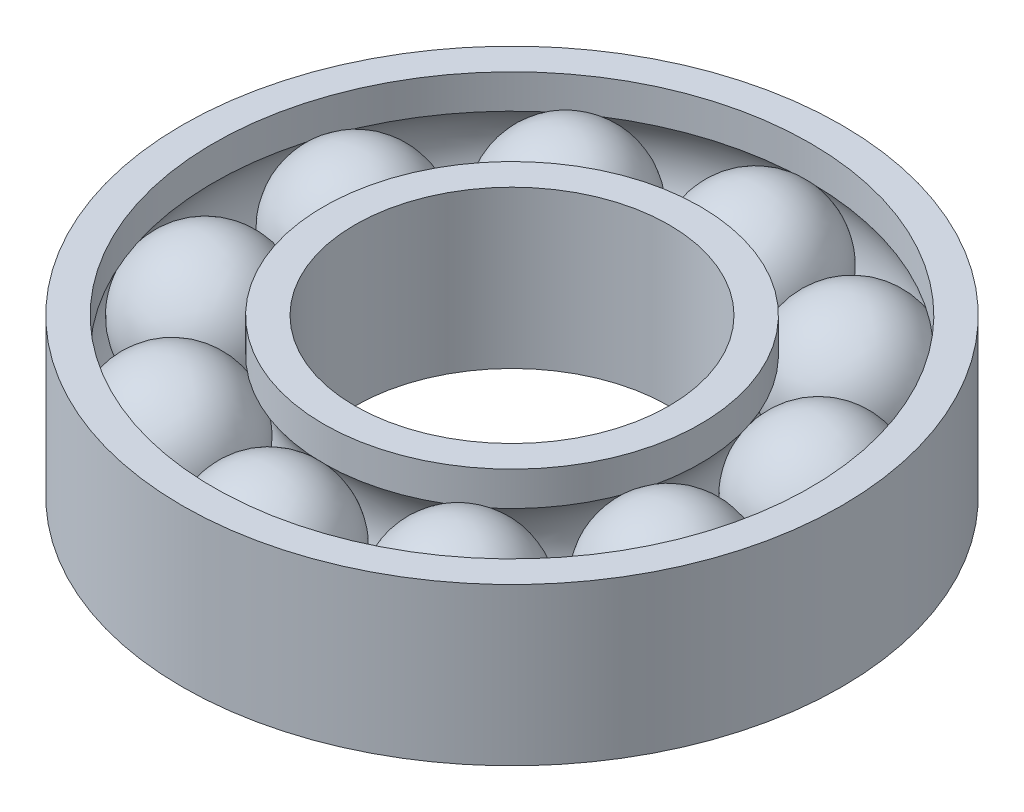
ISO-10303-21;
HEADER;
FILE_DESCRIPTION(('STEP AP214'),'2;1');
FILE_NAME('part.step','',(''),(''),'','','');
FILE_SCHEMA(('AUTOMOTIVE_DESIGN { 1 0 10303 214 1 1 1 1 }'));
ENDSEC;
DATA;
#1=APPLICATION_CONTEXT('core data for automotive mechanical design processes');
#2=APPLICATION_PROTOCOL_DEFINITION('international standard','automotive_design',2000,#1);
#3=PRODUCT_CONTEXT('',#1,'mechanical');
#4=PRODUCT('Part','Part','',(#3));
#5=PRODUCT_RELATED_PRODUCT_CATEGORY('part','',(#4));
#6=PRODUCT_DEFINITION_FORMATION('','',#4);
#7=PRODUCT_DEFINITION_CONTEXT('part definition',#1,'design');
#8=PRODUCT_DEFINITION('design','',#6,#7);
#9=PRODUCT_DEFINITION_SHAPE('','',#8);
#10=(LENGTH_UNIT() NAMED_UNIT(*) SI_UNIT(.MILLI.,.METRE.));
#11=(NAMED_UNIT(*) PLANE_ANGLE_UNIT() SI_UNIT($,.RADIAN.));
#12=(NAMED_UNIT(*) SI_UNIT($,.STERADIAN.) SOLID_ANGLE_UNIT());
#13=UNCERTAINTY_MEASURE_WITH_UNIT(LENGTH_MEASURE(1.E-05),#10,'distance_accuracy_value','');
#14=(GEOMETRIC_REPRESENTATION_CONTEXT(3) GLOBAL_UNCERTAINTY_ASSIGNED_CONTEXT((#13)) GLOBAL_UNIT_ASSIGNED_CONTEXT((#10,
#11,#12)) REPRESENTATION_CONTEXT('',''));
#15=CARTESIAN_POINT('',(0.,0.,0.));
#16=DIRECTION('',(0.,0.,1.));
#17=DIRECTION('',(1.,0.,0.));
#18=AXIS2_PLACEMENT_3D('',#15,#16,#17);
#19=CARTESIAN_POINT('',(45.5533570526658,0.,-62.698817064059));
#20=DIRECTION('',(-0.587785252292462,0.,0.809016994374955));
#21=DIRECTION('',(0.,-1.,0.));
#22=AXIS2_PLACEMENT_3D('',#19,#20,#21);
#23=SPHERICAL_SURFACE('',#22,22.5);
#24=CARTESIAN_POINT('',(32.3281888760854,0.,-44.4959346906225));
#25=VERTEX_POINT('',#24);
#26=VERTEX_LOOP('',#25);
#27=FACE_BOUND('',#26,.T.);
#28=ADVANCED_FACE('F41',(#27),#23,.T.);
#29=CLOSED_SHELL('',(#28));
#30=MANIFOLD_SOLID_BREP('B2',#29);
#31=CARTESIAN_POINT('',(73.7068800128742,0.,-23.9488170640593));
#32=DIRECTION('',(-0.95105651629515,0.,0.309016994374958));
#33=DIRECTION('',(0.,-1.,0.));
#34=AXIS2_PLACEMENT_3D('',#31,#32,#33);
#35=SPHERICAL_SURFACE('',#34,22.5);
#36=CARTESIAN_POINT('',(52.3081083962333,0.,-16.9959346906227));
#37=VERTEX_POINT('',#36);
#38=VERTEX_LOOP('',#37);
#39=FACE_BOUND('',#38,.T.);
#40=ADVANCED_FACE('F59',(#39),#35,.T.);
#41=CLOSED_SHELL('',(#40));
#42=MANIFOLD_SOLID_BREP('B6',#41);
#43=CARTESIAN_POINT('',(73.7068800128746,0.,23.9488170640577));
#44=DIRECTION('',(-0.951056516295157,0.,-0.309016994374938));
#45=DIRECTION('',(0.,-1.,0.));
#46=AXIS2_PLACEMENT_3D('',#43,#44,#45);
#47=SPHERICAL_SURFACE('',#46,22.5);
#48=CARTESIAN_POINT('',(52.3081083962336,0.,16.9959346906216));
#49=VERTEX_POINT('',#48);
#50=VERTEX_LOOP('',#49);
#51=FACE_BOUND('',#50,.T.);
#52=ADVANCED_FACE('F77',(#51),#47,.T.);
#53=CLOSED_SHELL('',(#52));
#54=MANIFOLD_SOLID_BREP('B37',#53);
#55=CARTESIAN_POINT('',(45.5533570526672,0.,62.698817064058));
#56=DIRECTION('',(-0.58778525229248,0.,-0.809016994374942));
#57=DIRECTION('',(0.,-1.,0.));
#58=AXIS2_PLACEMENT_3D('',#55,#56,#57);
#59=SPHERICAL_SURFACE('',#58,22.5);
#60=CARTESIAN_POINT('',(32.3281888760864,0.,44.4959346906218));
#61=VERTEX_POINT('',#60);
#62=VERTEX_LOOP('',#61);
#63=FACE_BOUND('',#62,.T.);
#64=ADVANCED_FACE('F95',(#63),#59,.T.);
#65=CLOSED_SHELL('',(#64));
#66=MANIFOLD_SOLID_BREP('B55',#65);
#67=CARTESIAN_POINT('',(0.,0.,77.5));
#68=DIRECTION('',(0.,0.,-1.));
#69=DIRECTION('',(0.,-1.,0.));
#70=AXIS2_PLACEMENT_3D('',#67,#68,#69);
#71=SPHERICAL_SURFACE('',#70,22.5);
#72=CARTESIAN_POINT('',(0.,0.,55.));
#73=VERTEX_POINT('',#72);
#74=VERTEX_LOOP('',#73);
#75=FACE_BOUND('',#74,.T.);
#76=ADVANCED_FACE('F113',(#75),#71,.T.);
#77=CLOSED_SHELL('',(#76));
#78=MANIFOLD_SOLID_BREP('B73',#77);
#79=CARTESIAN_POINT('',(-45.5533570526663,0.,62.6988170640587));
#80=DIRECTION('',(0.587785252292469,0.,-0.809016994374951));
#81=DIRECTION('',(0.,-1.,0.));
#82=AXIS2_PLACEMENT_3D('',#79,#80,#81);
#83=SPHERICAL_SURFACE('',#82,22.5);
#84=CARTESIAN_POINT('',(-32.3281888760858,0.,44.4959346906223));
#85=VERTEX_POINT('',#84);
#86=VERTEX_LOOP('',#85);
#87=FACE_BOUND('',#86,.T.);
#88=ADVANCED_FACE('F131',(#87),#83,.T.);
#89=CLOSED_SHELL('',(#88));
#90=MANIFOLD_SOLID_BREP('B91',#89);
#91=CARTESIAN_POINT('',(-73.7068800128743,0.,23.9488170640588));
#92=DIRECTION('',(0.951056516295152,0.,-0.309016994374952));
#93=DIRECTION('',(0.,-1.,0.));
#94=AXIS2_PLACEMENT_3D('',#91,#92,#93);
#95=SPHERICAL_SURFACE('',#94,22.5);
#96=CARTESIAN_POINT('',(-52.3081083962334,0.,16.9959346906223));
#97=VERTEX_POINT('',#96);
#98=VERTEX_LOOP('',#97);
#99=FACE_BOUND('',#98,.T.);
#100=ADVANCED_FACE('F149',(#99),#95,.T.);
#101=CLOSED_SHELL('',(#100));
#102=MANIFOLD_SOLID_BREP('B109',#101);
#103=CARTESIAN_POINT('',(-73.7068800128745,0.,-23.9488170640582));
#104=DIRECTION('',(0.951056516295155,0.,0.309016994374945));
#105=DIRECTION('',(0.,-1.,0.));
#106=AXIS2_PLACEMENT_3D('',#103,#104,#105);
#107=SPHERICAL_SURFACE('',#106,22.5);
#108=CARTESIAN_POINT('',(-52.3081083962335,0.,-16.995934690622));
#109=VERTEX_POINT('',#108);
#110=VERTEX_LOOP('',#109);
#111=FACE_BOUND('',#110,.T.);
#112=ADVANCED_FACE('F167',(#111),#107,.T.);
#113=CLOSED_SHELL('',(#112));
#114=MANIFOLD_SOLID_BREP('B127',#113);
#115=CARTESIAN_POINT('',(-45.5533570526668,0.,-62.6988170640584));
#116=DIRECTION('',(0.587785252292474,0.,0.809016994374947));
#117=DIRECTION('',(0.,-1.,0.));
#118=AXIS2_PLACEMENT_3D('',#115,#116,#117);
#119=SPHERICAL_SURFACE('',#118,22.5);
#120=CARTESIAN_POINT('',(-32.3281888760861,0.,-44.4959346906221));
#121=VERTEX_POINT('',#120);
#122=VERTEX_LOOP('',#121);
#123=FACE_BOUND('',#122,.T.);
#124=ADVANCED_FACE('F187',(#123),#119,.T.);
#125=CLOSED_SHELL('',(#124));
#126=MANIFOLD_SOLID_BREP('B145',#125);
#127=CARTESIAN_POINT('',(0.,0.,0.));
#128=DIRECTION('',(0.,-1.,0.));
#129=DIRECTION('',(0.,0.,-1.));
#130=AXIS2_PLACEMENT_3D('',#127,#128,#129);
#131=TOROIDAL_SURFACE('',#130,77.5,22.5);
#132=CARTESIAN_POINT('',(0.,14.1421356237309,0.));
#133=DIRECTION('',(0.,-1.,0.));
#134=DIRECTION('',(0.,0.,-1.));
#135=AXIS2_PLACEMENT_3D('',#132,#133,#134);
#136=CIRCLE('',#135,95.);
#137=CARTESIAN_POINT('',(0.,14.1421356237309,-95.));
#138=VERTEX_POINT('',#137);
#139=EDGE_CURVE('E229',#138,#138,#136,.T.);
#140=ORIENTED_EDGE('',*,*,#139,.F.);
#141=EDGE_LOOP('',(#140));
#142=FACE_BOUND('',#141,.T.);
#143=CARTESIAN_POINT('',(0.,-14.1421356237309,0.));
#144=DIRECTION('',(0.,-1.,0.));
#145=DIRECTION('',(0.,0.,-1.));
#146=AXIS2_PLACEMENT_3D('',#143,#144,#145);
#147=CIRCLE('',#146,95.);
#148=CARTESIAN_POINT('',(0.,-14.1421356237309,-95.));
#149=VERTEX_POINT('',#148);
#150=EDGE_CURVE('E186',#149,#149,#147,.T.);
#151=ORIENTED_EDGE('',*,*,#150,.T.);
#152=EDGE_LOOP('',(#151));
#153=FACE_BOUND('',#152,.T.);
#154=ADVANCED_FACE('F207',(#142,#153),#131,.F.);
#155=CARTESIAN_POINT('',(0.,-25.,0.));
#156=DIRECTION('',(0.,-1.,0.));
#157=DIRECTION('',(0.,0.,-1.));
#158=AXIS2_PLACEMENT_3D('',#155,#156,#157);
#159=CYLINDRICAL_SURFACE('',#158,95.);
#160=ORIENTED_EDGE('',*,*,#150,.F.);
#161=EDGE_LOOP('',(#160));
#162=FACE_BOUND('',#161,.T.);
#163=CARTESIAN_POINT('',(0.,-25.,0.));
#164=DIRECTION('',(0.,-1.,0.));
#165=DIRECTION('',(0.,0.,-1.));
#166=AXIS2_PLACEMENT_3D('',#163,#164,#165);
#167=CIRCLE('',#166,95.);
#168=CARTESIAN_POINT('',(0.,-25.,-95.));
#169=VERTEX_POINT('',#168);
#170=EDGE_CURVE('E213',#169,#169,#167,.T.);
#171=ORIENTED_EDGE('',*,*,#170,.T.);
#172=EDGE_LOOP('',(#171));
#173=FACE_BOUND('',#172,.T.);
#174=ADVANCED_FACE('F236',(#162,#173),#159,.F.);
#175=CARTESIAN_POINT('',(0.,-25.,0.));
#176=DIRECTION('',(0.,-1.,0.));
#177=DIRECTION('',(0.,0.,-1.));
#178=AXIS2_PLACEMENT_3D('',#175,#176,#177);
#179=PLANE('',#178);
#180=CARTESIAN_POINT('',(0.,-25.,0.));
#181=DIRECTION('',(0.,-1.,0.));
#182=DIRECTION('',(0.,0.,-1.));
#183=AXIS2_PLACEMENT_3D('',#180,#181,#182);
#184=CIRCLE('',#183,105.);
#185=CARTESIAN_POINT('',(0.,-25.,-105.));
#186=VERTEX_POINT('',#185);
#187=EDGE_CURVE('E217',#186,#186,#184,.T.);
#188=ORIENTED_EDGE('',*,*,#187,.T.);
#189=EDGE_LOOP('',(#188));
#190=FACE_BOUND('',#189,.T.);
#191=ORIENTED_EDGE('',*,*,#170,.F.);
#192=EDGE_LOOP('',(#191));
#193=FACE_BOUND('',#192,.T.);
#194=ADVANCED_FACE('F240',(#190,#193),#179,.T.);
#195=CARTESIAN_POINT('',(0.,-25.,0.));
#196=DIRECTION('',(0.,-1.,0.));
#197=DIRECTION('',(0.,0.,-1.));
#198=AXIS2_PLACEMENT_3D('',#195,#196,#197);
#199=CYLINDRICAL_SURFACE('',#198,105.);
#200=CARTESIAN_POINT('',(0.,25.,0.));
#201=DIRECTION('',(0.,-1.,0.));
#202=DIRECTION('',(0.,0.,-1.));
#203=AXIS2_PLACEMENT_3D('',#200,#201,#202);
#204=CIRCLE('',#203,105.);
#205=CARTESIAN_POINT('',(0.,25.,-105.));
#206=VERTEX_POINT('',#205);
#207=EDGE_CURVE('E221',#206,#206,#204,.T.);
#208=ORIENTED_EDGE('',*,*,#207,.T.);
#209=EDGE_LOOP('',(#208));
#210=FACE_BOUND('',#209,.T.);
#211=ORIENTED_EDGE('',*,*,#187,.F.);
#212=EDGE_LOOP('',(#211));
#213=FACE_BOUND('',#212,.T.);
#214=ADVANCED_FACE('F245',(#210,#213),#199,.T.);
#215=CARTESIAN_POINT('',(0.,25.,0.));
#216=DIRECTION('',(0.,-1.,0.));
#217=DIRECTION('',(0.,0.,-1.));
#218=AXIS2_PLACEMENT_3D('',#215,#216,#217);
#219=PLANE('',#218);
#220=ORIENTED_EDGE('',*,*,#207,.F.);
#221=EDGE_LOOP('',(#220));
#222=FACE_BOUND('',#221,.T.);
#223=CARTESIAN_POINT('',(0.,25.,0.));
#224=DIRECTION('',(0.,-1.,0.));
#225=DIRECTION('',(0.,0.,-1.));
#226=AXIS2_PLACEMENT_3D('',#223,#224,#225);
#227=CIRCLE('',#226,95.);
#228=CARTESIAN_POINT('',(0.,25.,-95.));
#229=VERTEX_POINT('',#228);
#230=EDGE_CURVE('E226',#229,#229,#227,.T.);
#231=ORIENTED_EDGE('',*,*,#230,.T.);
#232=EDGE_LOOP('',(#231));
#233=FACE_BOUND('',#232,.T.);
#234=ADVANCED_FACE('F251',(#222,#233),#219,.F.);
#235=CARTESIAN_POINT('',(0.,-25.,0.));
#236=DIRECTION('',(0.,-1.,0.));
#237=DIRECTION('',(0.,0.,-1.));
#238=AXIS2_PLACEMENT_3D('',#235,#236,#237);
#239=CYLINDRICAL_SURFACE('',#238,95.);
#240=ORIENTED_EDGE('',*,*,#230,.F.);
#241=EDGE_LOOP('',(#240));
#242=FACE_BOUND('',#241,.T.);
#243=ORIENTED_EDGE('',*,*,#139,.T.);
#244=EDGE_LOOP('',(#243));
#245=FACE_BOUND('',#244,.T.);
#246=ADVANCED_FACE('F233',(#242,#245),#239,.F.);
#247=CLOSED_SHELL('',(#154,#174,#194,#214,#234,#246));
#248=MANIFOLD_SOLID_BREP('B163',#247);
#249=CARTESIAN_POINT('',(0.,0.,0.));
#250=DIRECTION('',(0.,-1.,0.));
#251=DIRECTION('',(0.,0.,-1.));
#252=AXIS2_PLACEMENT_3D('',#249,#250,#251);
#253=TOROIDAL_SURFACE('',#252,77.5,22.5);
#254=CARTESIAN_POINT('',(0.,-14.1421356237309,0.));
#255=DIRECTION('',(0.,-1.,0.));
#256=DIRECTION('',(0.,0.,-1.));
#257=AXIS2_PLACEMENT_3D('',#254,#255,#256);
#258=CIRCLE('',#257,60.);
#259=CARTESIAN_POINT('',(0.,-14.1421356237309,-60.));
#260=VERTEX_POINT('',#259);
#261=EDGE_CURVE('E325',#260,#260,#258,.T.);
#262=ORIENTED_EDGE('',*,*,#261,.F.);
#263=EDGE_LOOP('',(#262));
#264=FACE_BOUND('',#263,.T.);
#265=CARTESIAN_POINT('',(0.,14.1421356237309,0.));
#266=DIRECTION('',(0.,-1.,0.));
#267=DIRECTION('',(0.,0.,-1.));
#268=AXIS2_PLACEMENT_3D('',#265,#266,#267);
#269=CIRCLE('',#268,60.);
#270=CARTESIAN_POINT('',(0.,14.1421356237309,-60.));
#271=VERTEX_POINT('',#270);
#272=EDGE_CURVE('E206',#271,#271,#269,.T.);
#273=ORIENTED_EDGE('',*,*,#272,.T.);
#274=EDGE_LOOP('',(#273));
#275=FACE_BOUND('',#274,.T.);
#276=ADVANCED_FACE('F303',(#264,#275),#253,.F.);
#277=CARTESIAN_POINT('',(0.,-25.,0.));
#278=DIRECTION('',(0.,-1.,0.));
#279=DIRECTION('',(0.,0.,-1.));
#280=AXIS2_PLACEMENT_3D('',#277,#278,#279);
#281=CYLINDRICAL_SURFACE('',#280,60.);
#282=CARTESIAN_POINT('',(0.,25.,0.));
#283=DIRECTION('',(0.,-1.,0.));
#284=DIRECTION('',(0.,0.,-1.));
#285=AXIS2_PLACEMENT_3D('',#282,#283,#284);
#286=CIRCLE('',#285,60.);
#287=CARTESIAN_POINT('',(0.,25.,-60.));
#288=VERTEX_POINT('',#287);
#289=EDGE_CURVE('E309',#288,#288,#286,.T.);
#290=ORIENTED_EDGE('',*,*,#289,.T.);
#291=EDGE_LOOP('',(#290));
#292=FACE_BOUND('',#291,.T.);
#293=ORIENTED_EDGE('',*,*,#272,.F.);
#294=EDGE_LOOP('',(#293));
#295=FACE_BOUND('',#294,.T.);
#296=ADVANCED_FACE('F333',(#292,#295),#281,.T.);
#297=CARTESIAN_POINT('',(0.,25.,0.));
#298=DIRECTION('',(0.,-1.,0.));
#299=DIRECTION('',(0.,0.,-1.));
#300=AXIS2_PLACEMENT_3D('',#297,#298,#299);
#301=PLANE('',#300);
#302=ORIENTED_EDGE('',*,*,#289,.F.);
#303=EDGE_LOOP('',(#302));
#304=FACE_BOUND('',#303,.T.);
#305=CARTESIAN_POINT('',(0.,25.,0.));
#306=DIRECTION('',(0.,-1.,0.));
#307=DIRECTION('',(0.,0.,-1.));
#308=AXIS2_PLACEMENT_3D('',#305,#306,#307);
#309=CIRCLE('',#308,50.);
#310=CARTESIAN_POINT('',(0.,25.,-50.));
#311=VERTEX_POINT('',#310);
#312=EDGE_CURVE('E313',#311,#311,#309,.T.);
#313=ORIENTED_EDGE('',*,*,#312,.T.);
#314=EDGE_LOOP('',(#313));
#315=FACE_BOUND('',#314,.T.);
#316=ADVANCED_FACE('F337',(#304,#315),#301,.F.);
#317=CARTESIAN_POINT('',(0.,-25.,0.));
#318=DIRECTION('',(0.,-1.,0.));
#319=DIRECTION('',(0.,0.,-1.));
#320=AXIS2_PLACEMENT_3D('',#317,#318,#319);
#321=CYLINDRICAL_SURFACE('',#320,50.);
#322=ORIENTED_EDGE('',*,*,#312,.F.);
#323=EDGE_LOOP('',(#322));
#324=FACE_BOUND('',#323,.T.);
#325=CARTESIAN_POINT('',(0.,-25.,0.));
#326=DIRECTION('',(0.,-1.,0.));
#327=DIRECTION('',(0.,0.,-1.));
#328=AXIS2_PLACEMENT_3D('',#325,#326,#327);
#329=CIRCLE('',#328,50.);
#330=CARTESIAN_POINT('',(0.,-25.,-50.));
#331=VERTEX_POINT('',#330);
#332=EDGE_CURVE('E317',#331,#331,#329,.T.);
#333=ORIENTED_EDGE('',*,*,#332,.T.);
#334=EDGE_LOOP('',(#333));
#335=FACE_BOUND('',#334,.T.);
#336=ADVANCED_FACE('F341',(#324,#335),#321,.F.);
#337=CARTESIAN_POINT('',(0.,-25.,0.));
#338=DIRECTION('',(0.,-1.,0.));
#339=DIRECTION('',(0.,0.,-1.));
#340=AXIS2_PLACEMENT_3D('',#337,#338,#339);
#341=PLANE('',#340);
#342=CARTESIAN_POINT('',(0.,-25.,0.));
#343=DIRECTION('',(0.,-1.,0.));
#344=DIRECTION('',(0.,0.,-1.));
#345=AXIS2_PLACEMENT_3D('',#342,#343,#344);
#346=CIRCLE('',#345,60.);
#347=CARTESIAN_POINT('',(0.,-25.,-60.));
#348=VERTEX_POINT('',#347);
#349=EDGE_CURVE('E322',#348,#348,#346,.T.);
#350=ORIENTED_EDGE('',*,*,#349,.T.);
#351=EDGE_LOOP('',(#350));
#352=FACE_BOUND('',#351,.T.);
#353=ORIENTED_EDGE('',*,*,#332,.F.);
#354=EDGE_LOOP('',(#353));
#355=FACE_BOUND('',#354,.T.);
#356=ADVANCED_FACE('F348',(#352,#355),#341,.T.);
#357=CARTESIAN_POINT('',(0.,-25.,0.));
#358=DIRECTION('',(0.,-1.,0.));
#359=DIRECTION('',(0.,0.,-1.));
#360=AXIS2_PLACEMENT_3D('',#357,#358,#359);
#361=CYLINDRICAL_SURFACE('',#360,60.);
#362=ORIENTED_EDGE('',*,*,#261,.T.);
#363=EDGE_LOOP('',(#362));
#364=FACE_BOUND('',#363,.T.);
#365=ORIENTED_EDGE('',*,*,#349,.F.);
#366=EDGE_LOOP('',(#365));
#367=FACE_BOUND('',#366,.T.);
#368=ADVANCED_FACE('F329',(#364,#367),#361,.T.);
#369=CLOSED_SHELL('',(#276,#296,#316,#336,#356,#368));
#370=MANIFOLD_SOLID_BREP('B181',#369);
#371=CARTESIAN_POINT('',(0.,0.,-77.5));
#372=DIRECTION('',(0.,0.,1.));
#373=DIRECTION('',(0.,-1.,0.));
#374=AXIS2_PLACEMENT_3D('',#371,#372,#373);
#375=SPHERICAL_SURFACE('',#374,22.5);
#376=CARTESIAN_POINT('',(0.,0.,-55.));
#377=VERTEX_POINT('',#376);
#378=VERTEX_LOOP('',#377);
#379=FACE_BOUND('',#378,.T.);
#380=ADVANCED_FACE('F394',(#379),#375,.T.);
#381=CLOSED_SHELL('',(#380));
#382=MANIFOLD_SOLID_BREP('B201',#381);
#383=ADVANCED_BREP_SHAPE_REPRESENTATION('',(#18,#30,#42,#54,#66,#78,#90,#102,#114,#126,#248,
#370,#382),#14);
#384=SHAPE_DEFINITION_REPRESENTATION(#9,#383);
ENDSEC;
END-ISO-10303-21;
